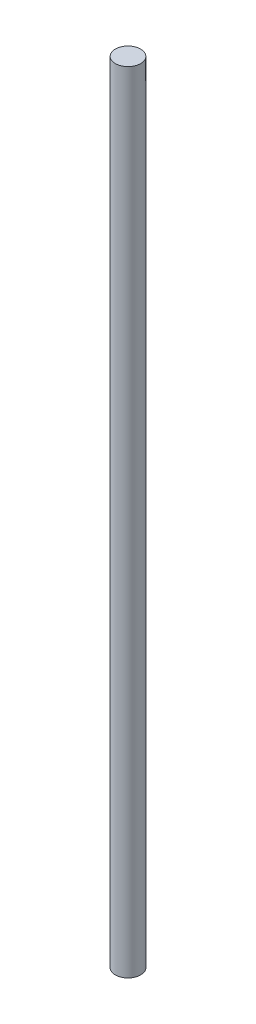
ISO-10303-21;
HEADER;
FILE_DESCRIPTION(('STEP AP214'),'2;1');
FILE_NAME('part.step','',(''),(''),'','','');
FILE_SCHEMA(('AUTOMOTIVE_DESIGN { 1 0 10303 214 1 1 1 1 }'));
ENDSEC;
DATA;
#1=APPLICATION_CONTEXT('core data for automotive mechanical design processes');
#2=APPLICATION_PROTOCOL_DEFINITION('international standard','automotive_design',2000,#1);
#3=PRODUCT_CONTEXT('',#1,'mechanical');
#4=PRODUCT('Part','Part','',(#3));
#5=PRODUCT_RELATED_PRODUCT_CATEGORY('part','',(#4));
#6=PRODUCT_DEFINITION_FORMATION('','',#4);
#7=PRODUCT_DEFINITION_CONTEXT('part definition',#1,'design');
#8=PRODUCT_DEFINITION('design','',#6,#7);
#9=PRODUCT_DEFINITION_SHAPE('','',#8);
#10=(LENGTH_UNIT() NAMED_UNIT(*) SI_UNIT(.MILLI.,.METRE.));
#11=(NAMED_UNIT(*) PLANE_ANGLE_UNIT() SI_UNIT($,.RADIAN.));
#12=(NAMED_UNIT(*) SI_UNIT($,.STERADIAN.) SOLID_ANGLE_UNIT());
#13=UNCERTAINTY_MEASURE_WITH_UNIT(LENGTH_MEASURE(1.E-05),#10,'distance_accuracy_value','');
#14=(GEOMETRIC_REPRESENTATION_CONTEXT(3) GLOBAL_UNCERTAINTY_ASSIGNED_CONTEXT((#13)) GLOBAL_UNIT_ASSIGNED_CONTEXT((#10,
#11,#12)) REPRESENTATION_CONTEXT('',''));
#15=CARTESIAN_POINT('',(0.,0.,0.));
#16=DIRECTION('',(0.,0.,1.));
#17=DIRECTION('',(1.,0.,0.));
#18=AXIS2_PLACEMENT_3D('',#15,#16,#17);
#19=CARTESIAN_POINT('',(0.,256.205882352941,0.));
#20=DIRECTION('',(0.,1.,0.));
#21=DIRECTION('',(-1.,0.,0.));
#22=AXIS2_PLACEMENT_3D('',#19,#20,#21);
#23=CYLINDRICAL_SURFACE('',#22,8.);
#24=CARTESIAN_POINT('',(0.,-243.794117647059,0.));
#25=DIRECTION('',(0.,1.,0.));
#26=DIRECTION('',(-1.,0.,0.));
#27=AXIS2_PLACEMENT_3D('',#24,#25,#26);
#28=CIRCLE('',#27,8.);
#29=CARTESIAN_POINT('',(-8.,-243.794117647059,0.));
#30=VERTEX_POINT('',#29);
#31=EDGE_CURVE('E36',#30,#30,#28,.T.);
#32=ORIENTED_EDGE('',*,*,#31,.T.);
#33=EDGE_LOOP('',(#32));
#34=FACE_BOUND('',#33,.T.);
#35=CARTESIAN_POINT('',(0.,256.205882352941,0.));
#36=DIRECTION('',(0.,1.,0.));
#37=DIRECTION('',(-1.,0.,0.));
#38=AXIS2_PLACEMENT_3D('',#35,#36,#37);
#39=CIRCLE('',#38,8.);
#40=CARTESIAN_POINT('',(-7.99999999999999,256.205882352941,0.));
#41=VERTEX_POINT('',#40);
#42=EDGE_CURVE('E10',#41,#41,#39,.T.);
#43=ORIENTED_EDGE('',*,*,#42,.F.);
#44=EDGE_LOOP('',(#43));
#45=FACE_BOUND('',#44,.T.);
#46=ADVANCED_FACE('F30',(#34,#45),#23,.T.);
#47=CARTESIAN_POINT('',(-7.99999999999999,256.205882352941,0.));
#48=DIRECTION('',(0.,-1.,0.));
#49=DIRECTION('',(1.,0.,0.));
#50=AXIS2_PLACEMENT_3D('',#47,#48,#49);
#51=PLANE('',#50);
#52=ORIENTED_EDGE('',*,*,#42,.T.);
#53=EDGE_LOOP('',(#52));
#54=FACE_BOUND('',#53,.T.);
#55=ADVANCED_FACE('F46',(#54),#51,.F.);
#56=CARTESIAN_POINT('',(0.,-243.794117647059,0.));
#57=DIRECTION('',(0.,1.,0.));
#58=DIRECTION('',(-1.,0.,0.));
#59=AXIS2_PLACEMENT_3D('',#56,#57,#58);
#60=PLANE('',#59);
#61=ORIENTED_EDGE('',*,*,#31,.F.);
#62=EDGE_LOOP('',(#61));
#63=FACE_BOUND('',#62,.T.);
#64=ADVANCED_FACE('F44',(#63),#60,.F.);
#65=CLOSED_SHELL('',(#46,#55,#64));
#66=MANIFOLD_SOLID_BREP('B2',#65);
#67=ADVANCED_BREP_SHAPE_REPRESENTATION('',(#18,#66),#14);
#68=SHAPE_DEFINITION_REPRESENTATION(#9,#67);
ENDSEC;
END-ISO-10303-21;
